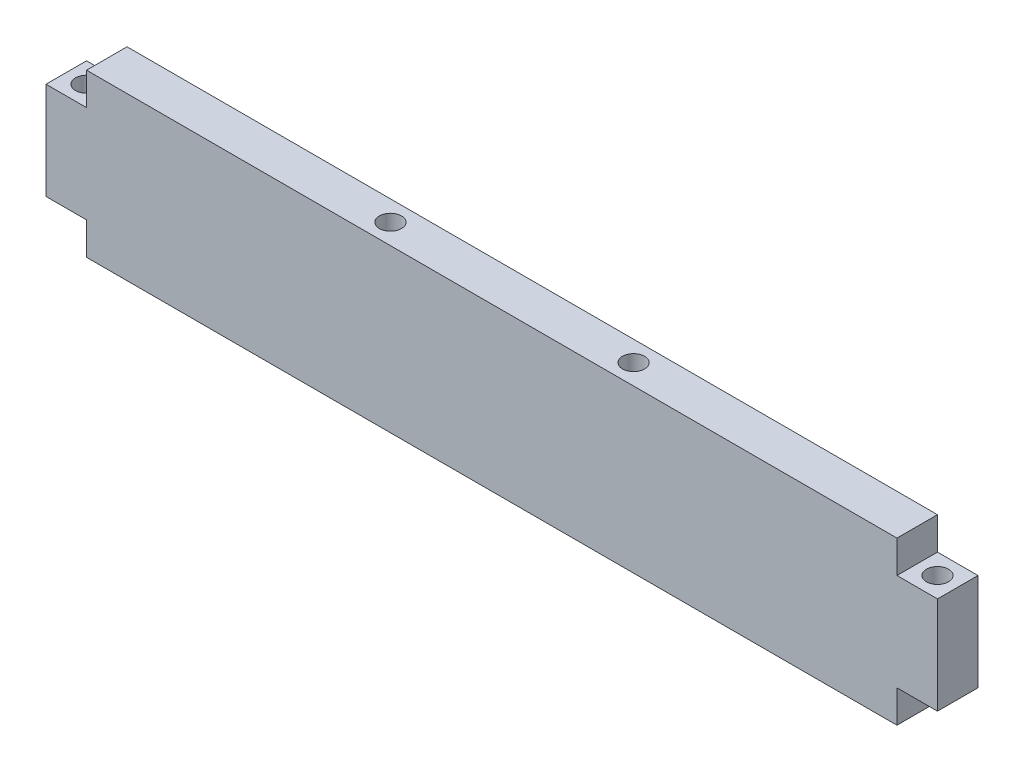
ISO-10303-21;
HEADER;
FILE_DESCRIPTION(('STEP AP214'),'2;1');
FILE_NAME('part.step','',(''),(''),'','','');
FILE_SCHEMA(('AUTOMOTIVE_DESIGN { 1 0 10303 214 1 1 1 1 }'));
ENDSEC;
DATA;
#1=APPLICATION_CONTEXT('core data for automotive mechanical design processes');
#2=APPLICATION_PROTOCOL_DEFINITION('international standard','automotive_design',2000,#1);
#3=PRODUCT_CONTEXT('',#1,'mechanical');
#4=PRODUCT('Part','Part','',(#3));
#5=PRODUCT_RELATED_PRODUCT_CATEGORY('part','',(#4));
#6=PRODUCT_DEFINITION_FORMATION('','',#4);
#7=PRODUCT_DEFINITION_CONTEXT('part definition',#1,'design');
#8=PRODUCT_DEFINITION('design','',#6,#7);
#9=PRODUCT_DEFINITION_SHAPE('','',#8);
#10=(LENGTH_UNIT() NAMED_UNIT(*) SI_UNIT(.MILLI.,.METRE.));
#11=(NAMED_UNIT(*) PLANE_ANGLE_UNIT() SI_UNIT($,.RADIAN.));
#12=(NAMED_UNIT(*) SI_UNIT($,.STERADIAN.) SOLID_ANGLE_UNIT());
#13=UNCERTAINTY_MEASURE_WITH_UNIT(LENGTH_MEASURE(1.E-05),#10,'distance_accuracy_value','');
#14=(GEOMETRIC_REPRESENTATION_CONTEXT(3) GLOBAL_UNCERTAINTY_ASSIGNED_CONTEXT((#13)) GLOBAL_UNIT_ASSIGNED_CONTEXT((#10,
#11,#12)) REPRESENTATION_CONTEXT('',''));
#15=CARTESIAN_POINT('',(0.,0.,0.));
#16=DIRECTION('',(0.,0.,1.));
#17=DIRECTION('',(1.,0.,0.));
#18=AXIS2_PLACEMENT_3D('',#15,#16,#17);
#19=CARTESIAN_POINT('',(-69.85,-12.7,3.175));
#20=DIRECTION('',(0.,1.,0.));
#21=DIRECTION('',(0.,0.,1.));
#22=AXIS2_PLACEMENT_3D('',#19,#20,#21);
#23=PLANE('',#22);
#24=DIRECTION('',(1.,0.,0.));
#25=VECTOR('',#24,1.);
#26=CARTESIAN_POINT('',(-69.85,-12.7,3.175));
#27=LINE('',#26,#25);
#28=CARTESIAN_POINT('',(-63.5,-12.7,3.175));
#29=VERTEX_POINT('',#28);
#30=CARTESIAN_POINT('',(63.5,-12.7,3.175));
#31=VERTEX_POINT('',#30);
#32=EDGE_CURVE('E11',#29,#31,#27,.T.);
#33=ORIENTED_EDGE('',*,*,#32,.F.);
#34=DIRECTION('',(0.,0.,1.));
#35=VECTOR('',#34,1.);
#36=CARTESIAN_POINT('',(-63.5,-12.7,-3.176));
#37=LINE('',#36,#35);
#38=CARTESIAN_POINT('',(-63.5,-12.7,-3.175));
#39=VERTEX_POINT('',#38);
#40=EDGE_CURVE('E146',#39,#29,#37,.T.);
#41=ORIENTED_EDGE('',*,*,#40,.F.);
#42=DIRECTION('',(1.,0.,0.));
#43=VECTOR('',#42,1.);
#44=CARTESIAN_POINT('',(-69.85,-12.7,-3.175));
#45=LINE('',#44,#43);
#46=CARTESIAN_POINT('',(63.5,-12.7,-3.175));
#47=VERTEX_POINT('',#46);
#48=EDGE_CURVE('E140',#39,#47,#45,.T.);
#49=ORIENTED_EDGE('',*,*,#48,.T.);
#50=DIRECTION('',(0.,0.,1.));
#51=VECTOR('',#50,1.);
#52=CARTESIAN_POINT('',(63.5,-12.7,-3.176));
#53=LINE('',#52,#51);
#54=EDGE_CURVE('E123',#47,#31,#53,.T.);
#55=ORIENTED_EDGE('',*,*,#54,.T.);
#56=EDGE_LOOP('',(#33,#41,#49,#55));
#57=FACE_BOUND('',#56,.T.);
#58=CARTESIAN_POINT('',(19.05,-12.7,0.));
#59=DIRECTION('',(0.,-1.,0.));
#60=DIRECTION('',(0.,0.,-1.));
#61=AXIS2_PLACEMENT_3D('',#58,#59,#60);
#62=CIRCLE('',#61,1.72719999999999);
#63=CARTESIAN_POINT('',(19.05,-12.7,-1.72719999999999));
#64=VERTEX_POINT('',#63);
#65=EDGE_CURVE('E169',#64,#64,#62,.T.);
#66=ORIENTED_EDGE('',*,*,#65,.F.);
#67=EDGE_LOOP('',(#66));
#68=FACE_BOUND('',#67,.T.);
#69=CARTESIAN_POINT('',(-19.05,-12.7,0.));
#70=DIRECTION('',(0.,-1.,0.));
#71=DIRECTION('',(0.,0.,-1.));
#72=AXIS2_PLACEMENT_3D('',#69,#70,#71);
#73=CIRCLE('',#72,1.72719999999999);
#74=CARTESIAN_POINT('',(-19.05,-12.7,-1.72719999999999));
#75=VERTEX_POINT('',#74);
#76=EDGE_CURVE('E173',#75,#75,#73,.T.);
#77=ORIENTED_EDGE('',*,*,#76,.F.);
#78=EDGE_LOOP('',(#77));
#79=FACE_BOUND('',#78,.T.);
#80=ADVANCED_FACE('F33',(#57,#68,#79),#23,.F.);
#81=CARTESIAN_POINT('',(69.85,-12.7,3.175));
#82=DIRECTION('',(-1.,0.,0.));
#83=DIRECTION('',(0.,0.,1.));
#84=AXIS2_PLACEMENT_3D('',#81,#82,#83);
#85=PLANE('',#84);
#86=DIRECTION('',(0.,1.,0.));
#87=VECTOR('',#86,1.);
#88=CARTESIAN_POINT('',(69.85,-12.7,-3.175));
#89=LINE('',#88,#87);
#90=CARTESIAN_POINT('',(69.85,-7.62,-3.175));
#91=VERTEX_POINT('',#90);
#92=CARTESIAN_POINT('',(69.85,7.62,-3.175));
#93=VERTEX_POINT('',#92);
#94=EDGE_CURVE('E238',#91,#93,#89,.T.);
#95=ORIENTED_EDGE('',*,*,#94,.T.);
#96=DIRECTION('',(0.,0.,1.));
#97=VECTOR('',#96,1.);
#98=CARTESIAN_POINT('',(69.85,7.62,-3.176));
#99=LINE('',#98,#97);
#100=CARTESIAN_POINT('',(69.85,7.62,3.175));
#101=VERTEX_POINT('',#100);
#102=EDGE_CURVE('E193',#93,#101,#99,.T.);
#103=ORIENTED_EDGE('',*,*,#102,.T.);
#104=DIRECTION('',(0.,1.,0.));
#105=VECTOR('',#104,1.);
#106=CARTESIAN_POINT('',(69.85,-12.7,3.175));
#107=LINE('',#106,#105);
#108=CARTESIAN_POINT('',(69.85,-7.62,3.175));
#109=VERTEX_POINT('',#108);
#110=EDGE_CURVE('E147',#109,#101,#107,.T.);
#111=ORIENTED_EDGE('',*,*,#110,.F.);
#112=DIRECTION('',(0.,0.,1.));
#113=VECTOR('',#112,1.);
#114=CARTESIAN_POINT('',(69.85,-7.62,-3.176));
#115=LINE('',#114,#113);
#116=EDGE_CURVE('E133',#91,#109,#115,.T.);
#117=ORIENTED_EDGE('',*,*,#116,.F.);
#118=EDGE_LOOP('',(#95,#103,#111,#117));
#119=FACE_BOUND('',#118,.T.);
#120=ADVANCED_FACE('F35',(#119),#85,.F.);
#121=CARTESIAN_POINT('',(-69.85,12.7,3.175));
#122=DIRECTION('',(0.,-1.,0.));
#123=DIRECTION('',(0.,0.,-1.));
#124=AXIS2_PLACEMENT_3D('',#121,#122,#123);
#125=PLANE('',#124);
#126=CARTESIAN_POINT('',(-19.05,12.7,0.));
#127=DIRECTION('',(0.,1.,0.));
#128=DIRECTION('',(0.,0.,1.));
#129=AXIS2_PLACEMENT_3D('',#126,#127,#128);
#130=CIRCLE('',#129,1.72719999999999);
#131=CARTESIAN_POINT('',(-19.05,12.7,1.72719999999999));
#132=VERTEX_POINT('',#131);
#133=EDGE_CURVE('E163',#132,#132,#130,.T.);
#134=ORIENTED_EDGE('',*,*,#133,.F.);
#135=EDGE_LOOP('',(#134));
#136=FACE_BOUND('',#135,.T.);
#137=CARTESIAN_POINT('',(19.05,12.7,0.));
#138=DIRECTION('',(0.,1.,0.));
#139=DIRECTION('',(0.,0.,1.));
#140=AXIS2_PLACEMENT_3D('',#137,#138,#139);
#141=CIRCLE('',#140,1.72719999999999);
#142=CARTESIAN_POINT('',(19.05,12.7,1.72719999999999));
#143=VERTEX_POINT('',#142);
#144=EDGE_CURVE('E160',#143,#143,#141,.T.);
#145=ORIENTED_EDGE('',*,*,#144,.F.);
#146=EDGE_LOOP('',(#145));
#147=FACE_BOUND('',#146,.T.);
#148=DIRECTION('',(-1.,0.,0.));
#149=VECTOR('',#148,1.);
#150=CARTESIAN_POINT('',(-69.85,12.7,3.175));
#151=LINE('',#150,#149);
#152=CARTESIAN_POINT('',(63.5,12.7,3.175));
#153=VERTEX_POINT('',#152);
#154=CARTESIAN_POINT('',(-63.5,12.7,3.175));
#155=VERTEX_POINT('',#154);
#156=EDGE_CURVE('E151',#153,#155,#151,.T.);
#157=ORIENTED_EDGE('',*,*,#156,.F.);
#158=DIRECTION('',(0.,0.,1.));
#159=VECTOR('',#158,1.);
#160=CARTESIAN_POINT('',(63.5,12.7,-3.176));
#161=LINE('',#160,#159);
#162=CARTESIAN_POINT('',(63.5,12.7,-3.175));
#163=VERTEX_POINT('',#162);
#164=EDGE_CURVE('E217',#163,#153,#161,.T.);
#165=ORIENTED_EDGE('',*,*,#164,.F.);
#166=DIRECTION('',(-1.,0.,0.));
#167=VECTOR('',#166,1.);
#168=CARTESIAN_POINT('',(-69.85,12.7,-3.175));
#169=LINE('',#168,#167);
#170=CARTESIAN_POINT('',(-63.5,12.7,-3.175));
#171=VERTEX_POINT('',#170);
#172=EDGE_CURVE('E154',#163,#171,#169,.T.);
#173=ORIENTED_EDGE('',*,*,#172,.T.);
#174=DIRECTION('',(0.,0.,1.));
#175=VECTOR('',#174,1.);
#176=CARTESIAN_POINT('',(-63.5,12.7,-3.176));
#177=LINE('',#176,#175);
#178=EDGE_CURVE('E230',#171,#155,#177,.T.);
#179=ORIENTED_EDGE('',*,*,#178,.T.);
#180=EDGE_LOOP('',(#157,#165,#173,#179));
#181=FACE_BOUND('',#180,.T.);
#182=ADVANCED_FACE('F250',(#136,#147,#181),#125,.F.);
#183=CARTESIAN_POINT('',(-69.85,-12.7,3.175));
#184=DIRECTION('',(1.,0.,0.));
#185=DIRECTION('',(0.,0.,-1.));
#186=AXIS2_PLACEMENT_3D('',#183,#184,#185);
#187=PLANE('',#186);
#188=DIRECTION('',(0.,-1.,0.));
#189=VECTOR('',#188,1.);
#190=CARTESIAN_POINT('',(-69.85,-12.7,-3.175));
#191=LINE('',#190,#189);
#192=CARTESIAN_POINT('',(-69.85,7.62,-3.175));
#193=VERTEX_POINT('',#192);
#194=CARTESIAN_POINT('',(-69.85,-7.62,-3.175));
#195=VERTEX_POINT('',#194);
#196=EDGE_CURVE('E148',#193,#195,#191,.T.);
#197=ORIENTED_EDGE('',*,*,#196,.T.);
#198=DIRECTION('',(0.,0.,1.));
#199=VECTOR('',#198,1.);
#200=CARTESIAN_POINT('',(-69.85,-7.62,-3.176));
#201=LINE('',#200,#199);
#202=CARTESIAN_POINT('',(-69.85,-7.62,3.175));
#203=VERTEX_POINT('',#202);
#204=EDGE_CURVE('E201',#195,#203,#201,.T.);
#205=ORIENTED_EDGE('',*,*,#204,.T.);
#206=DIRECTION('',(0.,-1.,0.));
#207=VECTOR('',#206,1.);
#208=CARTESIAN_POINT('',(-69.85,-12.7,3.175));
#209=LINE('',#208,#207);
#210=CARTESIAN_POINT('',(-69.85,7.62,3.175));
#211=VERTEX_POINT('',#210);
#212=EDGE_CURVE('E42',#211,#203,#209,.T.);
#213=ORIENTED_EDGE('',*,*,#212,.F.);
#214=DIRECTION('',(0.,0.,1.));
#215=VECTOR('',#214,1.);
#216=CARTESIAN_POINT('',(-69.85,7.62,-3.176));
#217=LINE('',#216,#215);
#218=EDGE_CURVE('E229',#193,#211,#217,.T.);
#219=ORIENTED_EDGE('',*,*,#218,.F.);
#220=EDGE_LOOP('',(#197,#205,#213,#219));
#221=FACE_BOUND('',#220,.T.);
#222=ADVANCED_FACE('F290',(#221),#187,.F.);
#223=CARTESIAN_POINT('',(0.,0.,3.175));
#224=DIRECTION('',(0.,0.,-1.));
#225=DIRECTION('',(-1.,0.,0.));
#226=AXIS2_PLACEMENT_3D('',#223,#224,#225);
#227=PLANE('',#226);
#228=DIRECTION('',(-1.,0.,0.));
#229=VECTOR('',#228,1.);
#230=CARTESIAN_POINT('',(-69.85,-7.62,3.175));
#231=LINE('',#230,#229);
#232=CARTESIAN_POINT('',(-63.5,-7.62,3.175));
#233=VERTEX_POINT('',#232);
#234=EDGE_CURVE('E196',#233,#203,#231,.T.);
#235=ORIENTED_EDGE('',*,*,#234,.F.);
#236=DIRECTION('',(0.,1.,0.));
#237=VECTOR('',#236,1.);
#238=CARTESIAN_POINT('',(-63.5,-7.62,3.175));
#239=LINE('',#238,#237);
#240=EDGE_CURVE('E192',#29,#233,#239,.T.);
#241=ORIENTED_EDGE('',*,*,#240,.F.);
#242=ORIENTED_EDGE('',*,*,#32,.T.);
#243=DIRECTION('',(0.,-1.,0.));
#244=VECTOR('',#243,1.);
#245=CARTESIAN_POINT('',(63.5,-12.7,3.175));
#246=LINE('',#245,#244);
#247=CARTESIAN_POINT('',(63.5,-7.62,3.175));
#248=VERTEX_POINT('',#247);
#249=EDGE_CURVE('E129',#248,#31,#246,.T.);
#250=ORIENTED_EDGE('',*,*,#249,.F.);
#251=DIRECTION('',(-1.,0.,0.));
#252=VECTOR('',#251,1.);
#253=CARTESIAN_POINT('',(69.85,-7.62,3.175));
#254=LINE('',#253,#252);
#255=EDGE_CURVE('E134',#109,#248,#254,.T.);
#256=ORIENTED_EDGE('',*,*,#255,.F.);
#257=ORIENTED_EDGE('',*,*,#110,.T.);
#258=DIRECTION('',(1.,0.,0.));
#259=VECTOR('',#258,1.);
#260=CARTESIAN_POINT('',(69.85,7.62,3.175));
#261=LINE('',#260,#259);
#262=CARTESIAN_POINT('',(63.5,7.62,3.175));
#263=VERTEX_POINT('',#262);
#264=EDGE_CURVE('E215',#263,#101,#261,.T.);
#265=ORIENTED_EDGE('',*,*,#264,.F.);
#266=DIRECTION('',(0.,-1.,0.));
#267=VECTOR('',#266,1.);
#268=CARTESIAN_POINT('',(63.5,7.62,3.175));
#269=LINE('',#268,#267);
#270=EDGE_CURVE('E213',#153,#263,#269,.T.);
#271=ORIENTED_EDGE('',*,*,#270,.F.);
#272=ORIENTED_EDGE('',*,*,#156,.T.);
#273=DIRECTION('',(0.,1.,0.));
#274=VECTOR('',#273,1.);
#275=CARTESIAN_POINT('',(-63.5,12.7,3.175));
#276=LINE('',#275,#274);
#277=CARTESIAN_POINT('',(-63.5,7.62,3.175));
#278=VERTEX_POINT('',#277);
#279=EDGE_CURVE('E227',#278,#155,#276,.T.);
#280=ORIENTED_EDGE('',*,*,#279,.F.);
#281=DIRECTION('',(1.,0.,0.));
#282=VECTOR('',#281,1.);
#283=CARTESIAN_POINT('',(-69.85,7.62,3.175));
#284=LINE('',#283,#282);
#285=EDGE_CURVE('E224',#211,#278,#284,.T.);
#286=ORIENTED_EDGE('',*,*,#285,.F.);
#287=ORIENTED_EDGE('',*,*,#212,.T.);
#288=EDGE_LOOP('',(#235,#241,#242,#250,#256,#257,#265,#271,#272,#280,#286,#287));
#289=FACE_BOUND('',#288,.T.);
#290=ADVANCED_FACE('F259',(#289),#227,.F.);
#291=CARTESIAN_POINT('',(0.,0.,-3.175));
#292=DIRECTION('',(0.,0.,-1.));
#293=DIRECTION('',(-1.,0.,0.));
#294=AXIS2_PLACEMENT_3D('',#291,#292,#293);
#295=PLANE('',#294);
#296=DIRECTION('',(0.,1.,0.));
#297=VECTOR('',#296,1.);
#298=CARTESIAN_POINT('',(-63.5,-7.62,-3.175));
#299=LINE('',#298,#297);
#300=CARTESIAN_POINT('',(-63.5,-7.62,-3.175));
#301=VERTEX_POINT('',#300);
#302=EDGE_CURVE('E190',#39,#301,#299,.T.);
#303=ORIENTED_EDGE('',*,*,#302,.T.);
#304=DIRECTION('',(-1.,0.,0.));
#305=VECTOR('',#304,1.);
#306=CARTESIAN_POINT('',(-69.85,-7.62,-3.175));
#307=LINE('',#306,#305);
#308=EDGE_CURVE('E200',#301,#195,#307,.T.);
#309=ORIENTED_EDGE('',*,*,#308,.T.);
#310=ORIENTED_EDGE('',*,*,#196,.F.);
#311=DIRECTION('',(1.,0.,0.));
#312=VECTOR('',#311,1.);
#313=CARTESIAN_POINT('',(-69.85,7.62,-3.175));
#314=LINE('',#313,#312);
#315=CARTESIAN_POINT('',(-63.5,7.62,-3.175));
#316=VERTEX_POINT('',#315);
#317=EDGE_CURVE('E233',#193,#316,#314,.T.);
#318=ORIENTED_EDGE('',*,*,#317,.T.);
#319=DIRECTION('',(0.,1.,0.));
#320=VECTOR('',#319,1.);
#321=CARTESIAN_POINT('',(-63.5,12.7,-3.175));
#322=LINE('',#321,#320);
#323=EDGE_CURVE('E207',#316,#171,#322,.T.);
#324=ORIENTED_EDGE('',*,*,#323,.T.);
#325=ORIENTED_EDGE('',*,*,#172,.F.);
#326=DIRECTION('',(0.,-1.,0.));
#327=VECTOR('',#326,1.);
#328=CARTESIAN_POINT('',(63.5,7.62,-3.175));
#329=LINE('',#328,#327);
#330=CARTESIAN_POINT('',(63.5,7.62,-3.175));
#331=VERTEX_POINT('',#330);
#332=EDGE_CURVE('E188',#163,#331,#329,.T.);
#333=ORIENTED_EDGE('',*,*,#332,.T.);
#334=DIRECTION('',(1.,0.,0.));
#335=VECTOR('',#334,1.);
#336=CARTESIAN_POINT('',(69.85,7.62,-3.175));
#337=LINE('',#336,#335);
#338=EDGE_CURVE('E210',#331,#93,#337,.T.);
#339=ORIENTED_EDGE('',*,*,#338,.T.);
#340=ORIENTED_EDGE('',*,*,#94,.F.);
#341=DIRECTION('',(-1.,0.,0.));
#342=VECTOR('',#341,1.);
#343=CARTESIAN_POINT('',(69.85,-7.62,-3.175));
#344=LINE('',#343,#342);
#345=CARTESIAN_POINT('',(63.5,-7.62,-3.175));
#346=VERTEX_POINT('',#345);
#347=EDGE_CURVE('E142',#91,#346,#344,.T.);
#348=ORIENTED_EDGE('',*,*,#347,.T.);
#349=DIRECTION('',(0.,-1.,0.));
#350=VECTOR('',#349,1.);
#351=CARTESIAN_POINT('',(63.5,-12.7,-3.175));
#352=LINE('',#351,#350);
#353=EDGE_CURVE('E126',#346,#47,#352,.T.);
#354=ORIENTED_EDGE('',*,*,#353,.T.);
#355=ORIENTED_EDGE('',*,*,#48,.F.);
#356=EDGE_LOOP('',(#303,#309,#310,#318,#324,#325,#333,#339,#340,#348,#354,#355));
#357=FACE_BOUND('',#356,.T.);
#358=ADVANCED_FACE('F139',(#357),#295,.T.);
#359=CARTESIAN_POINT('',(-63.5,12.7,-3.176));
#360=DIRECTION('',(1.,0.,0.));
#361=DIRECTION('',(0.,0.,-1.));
#362=AXIS2_PLACEMENT_3D('',#359,#360,#361);
#363=PLANE('',#362);
#364=DIRECTION('',(0.,0.,1.));
#365=VECTOR('',#364,1.);
#366=CARTESIAN_POINT('',(-63.5,7.62,-3.176));
#367=LINE('',#366,#365);
#368=EDGE_CURVE('E234',#316,#278,#367,.T.);
#369=ORIENTED_EDGE('',*,*,#368,.T.);
#370=ORIENTED_EDGE('',*,*,#279,.T.);
#371=ORIENTED_EDGE('',*,*,#178,.F.);
#372=ORIENTED_EDGE('',*,*,#323,.F.);
#373=EDGE_LOOP('',(#369,#370,#371,#372));
#374=FACE_BOUND('',#373,.T.);
#375=ADVANCED_FACE('F254',(#374),#363,.F.);
#376=CARTESIAN_POINT('',(-69.85,7.62,-3.176));
#377=DIRECTION('',(0.,-1.,0.));
#378=DIRECTION('',(0.,0.,-1.));
#379=AXIS2_PLACEMENT_3D('',#376,#377,#378);
#380=PLANE('',#379);
#381=CARTESIAN_POINT('',(-66.675,7.62,0.));
#382=DIRECTION('',(0.,-1.,0.));
#383=DIRECTION('',(0.,0.,-1.));
#384=AXIS2_PLACEMENT_3D('',#381,#382,#383);
#385=CIRCLE('',#384,1.72719999999998);
#386=CARTESIAN_POINT('',(-66.675,7.62,-1.72719999999998));
#387=VERTEX_POINT('',#386);
#388=EDGE_CURVE('E161',#387,#387,#385,.T.);
#389=ORIENTED_EDGE('',*,*,#388,.T.);
#390=EDGE_LOOP('',(#389));
#391=FACE_BOUND('',#390,.T.);
#392=ORIENTED_EDGE('',*,*,#218,.T.);
#393=ORIENTED_EDGE('',*,*,#285,.T.);
#394=ORIENTED_EDGE('',*,*,#368,.F.);
#395=ORIENTED_EDGE('',*,*,#317,.F.);
#396=EDGE_LOOP('',(#392,#393,#394,#395));
#397=FACE_BOUND('',#396,.T.);
#398=ADVANCED_FACE('F322',(#391,#397),#380,.F.);
#399=CARTESIAN_POINT('',(63.5,-12.7,-3.176));
#400=DIRECTION('',(-1.,0.,0.));
#401=DIRECTION('',(0.,0.,1.));
#402=AXIS2_PLACEMENT_3D('',#399,#400,#401);
#403=PLANE('',#402);
#404=DIRECTION('',(0.,0.,1.));
#405=VECTOR('',#404,1.);
#406=CARTESIAN_POINT('',(63.5,-7.62,-3.176));
#407=LINE('',#406,#405);
#408=EDGE_CURVE('E58',#346,#248,#407,.T.);
#409=ORIENTED_EDGE('',*,*,#408,.T.);
#410=ORIENTED_EDGE('',*,*,#249,.T.);
#411=ORIENTED_EDGE('',*,*,#54,.F.);
#412=ORIENTED_EDGE('',*,*,#353,.F.);
#413=EDGE_LOOP('',(#409,#410,#411,#412));
#414=FACE_BOUND('',#413,.T.);
#415=ADVANCED_FACE('F125',(#414),#403,.F.);
#416=CARTESIAN_POINT('',(69.85,-7.62,-3.176));
#417=DIRECTION('',(0.,1.,0.));
#418=DIRECTION('',(-1.,0.,0.));
#419=AXIS2_PLACEMENT_3D('',#416,#417,#418);
#420=PLANE('',#419);
#421=CARTESIAN_POINT('',(66.675,-7.62,0.));
#422=DIRECTION('',(0.,1.,0.));
#423=DIRECTION('',(-1.,0.,0.));
#424=AXIS2_PLACEMENT_3D('',#421,#422,#423);
#425=CIRCLE('',#424,1.72719999999998);
#426=CARTESIAN_POINT('',(64.9478,-7.62,0.));
#427=VERTEX_POINT('',#426);
#428=EDGE_CURVE('E37',#427,#427,#425,.T.);
#429=ORIENTED_EDGE('',*,*,#428,.T.);
#430=EDGE_LOOP('',(#429));
#431=FACE_BOUND('',#430,.T.);
#432=ORIENTED_EDGE('',*,*,#116,.T.);
#433=ORIENTED_EDGE('',*,*,#255,.T.);
#434=ORIENTED_EDGE('',*,*,#408,.F.);
#435=ORIENTED_EDGE('',*,*,#347,.F.);
#436=EDGE_LOOP('',(#432,#433,#434,#435));
#437=FACE_BOUND('',#436,.T.);
#438=ADVANCED_FACE('F276',(#431,#437),#420,.F.);
#439=CARTESIAN_POINT('',(69.85,7.62,-3.176));
#440=DIRECTION('',(0.,-1.,0.));
#441=DIRECTION('',(1.,0.,0.));
#442=AXIS2_PLACEMENT_3D('',#439,#440,#441);
#443=PLANE('',#442);
#444=CARTESIAN_POINT('',(66.675,7.62,0.));
#445=DIRECTION('',(0.,-1.,0.));
#446=DIRECTION('',(1.,0.,0.));
#447=AXIS2_PLACEMENT_3D('',#444,#445,#446);
#448=CIRCLE('',#447,1.72719999999998);
#449=CARTESIAN_POINT('',(68.4022,7.62,0.));
#450=VERTEX_POINT('',#449);
#451=EDGE_CURVE('E158',#450,#450,#448,.T.);
#452=ORIENTED_EDGE('',*,*,#451,.T.);
#453=EDGE_LOOP('',(#452));
#454=FACE_BOUND('',#453,.T.);
#455=DIRECTION('',(0.,0.,1.));
#456=VECTOR('',#455,1.);
#457=CARTESIAN_POINT('',(63.5,7.62,-3.176));
#458=LINE('',#457,#456);
#459=EDGE_CURVE('E50',#331,#263,#458,.T.);
#460=ORIENTED_EDGE('',*,*,#459,.T.);
#461=ORIENTED_EDGE('',*,*,#264,.T.);
#462=ORIENTED_EDGE('',*,*,#102,.F.);
#463=ORIENTED_EDGE('',*,*,#338,.F.);
#464=EDGE_LOOP('',(#460,#461,#462,#463));
#465=FACE_BOUND('',#464,.T.);
#466=ADVANCED_FACE('F266',(#454,#465),#443,.F.);
#467=CARTESIAN_POINT('',(63.5,7.62,-3.176));
#468=DIRECTION('',(-1.,0.,0.));
#469=DIRECTION('',(0.,0.,1.));
#470=AXIS2_PLACEMENT_3D('',#467,#468,#469);
#471=PLANE('',#470);
#472=ORIENTED_EDGE('',*,*,#164,.T.);
#473=ORIENTED_EDGE('',*,*,#270,.T.);
#474=ORIENTED_EDGE('',*,*,#459,.F.);
#475=ORIENTED_EDGE('',*,*,#332,.F.);
#476=EDGE_LOOP('',(#472,#473,#474,#475));
#477=FACE_BOUND('',#476,.T.);
#478=ADVANCED_FACE('F263',(#477),#471,.F.);
#479=CARTESIAN_POINT('',(-63.5,-7.62,-3.176));
#480=DIRECTION('',(1.,0.,0.));
#481=DIRECTION('',(0.,0.,-1.));
#482=AXIS2_PLACEMENT_3D('',#479,#480,#481);
#483=PLANE('',#482);
#484=ORIENTED_EDGE('',*,*,#40,.T.);
#485=ORIENTED_EDGE('',*,*,#240,.T.);
#486=DIRECTION('',(0.,0.,1.));
#487=VECTOR('',#486,1.);
#488=CARTESIAN_POINT('',(-63.5,-7.62,-3.176));
#489=LINE('',#488,#487);
#490=EDGE_CURVE('E198',#301,#233,#489,.T.);
#491=ORIENTED_EDGE('',*,*,#490,.F.);
#492=ORIENTED_EDGE('',*,*,#302,.F.);
#493=EDGE_LOOP('',(#484,#485,#491,#492));
#494=FACE_BOUND('',#493,.T.);
#495=ADVANCED_FACE('F265',(#494),#483,.F.);
#496=CARTESIAN_POINT('',(-69.85,-7.62,-3.176));
#497=DIRECTION('',(0.,1.,0.));
#498=DIRECTION('',(0.,0.,1.));
#499=AXIS2_PLACEMENT_3D('',#496,#497,#498);
#500=PLANE('',#499);
#501=CARTESIAN_POINT('',(-66.675,-7.62,0.));
#502=DIRECTION('',(0.,1.,0.));
#503=DIRECTION('',(0.,0.,1.));
#504=AXIS2_PLACEMENT_3D('',#501,#502,#503);
#505=CIRCLE('',#504,1.72719999999998);
#506=CARTESIAN_POINT('',(-66.675,-7.62,1.72719999999998));
#507=VERTEX_POINT('',#506);
#508=EDGE_CURVE('E178',#507,#507,#505,.T.);
#509=ORIENTED_EDGE('',*,*,#508,.T.);
#510=EDGE_LOOP('',(#509));
#511=FACE_BOUND('',#510,.T.);
#512=ORIENTED_EDGE('',*,*,#490,.T.);
#513=ORIENTED_EDGE('',*,*,#234,.T.);
#514=ORIENTED_EDGE('',*,*,#204,.F.);
#515=ORIENTED_EDGE('',*,*,#308,.F.);
#516=EDGE_LOOP('',(#512,#513,#514,#515));
#517=FACE_BOUND('',#516,.T.);
#518=ADVANCED_FACE('F272',(#511,#517),#500,.F.);
#519=CARTESIAN_POINT('',(66.675,12.7,0.));
#520=DIRECTION('',(0.,1.,0.));
#521=DIRECTION('',(0.,0.,1.));
#522=AXIS2_PLACEMENT_3D('',#519,#520,#521);
#523=CYLINDRICAL_SURFACE('',#522,1.72719999999998);
#524=ORIENTED_EDGE('',*,*,#451,.F.);
#525=EDGE_LOOP('',(#524));
#526=FACE_BOUND('',#525,.T.);
#527=ORIENTED_EDGE('',*,*,#428,.F.);
#528=EDGE_LOOP('',(#527));
#529=FACE_BOUND('',#528,.T.);
#530=ADVANCED_FACE('F306',(#526,#529),#523,.F.);
#531=CARTESIAN_POINT('',(19.05,12.7,0.));
#532=DIRECTION('',(0.,1.,0.));
#533=DIRECTION('',(0.,0.,1.));
#534=AXIS2_PLACEMENT_3D('',#531,#532,#533);
#535=CYLINDRICAL_SURFACE('',#534,1.72719999999999);
#536=ORIENTED_EDGE('',*,*,#144,.T.);
#537=EDGE_LOOP('',(#536));
#538=FACE_BOUND('',#537,.T.);
#539=ORIENTED_EDGE('',*,*,#65,.T.);
#540=EDGE_LOOP('',(#539));
#541=FACE_BOUND('',#540,.T.);
#542=ADVANCED_FACE('F303',(#538,#541),#535,.F.);
#543=CARTESIAN_POINT('',(-19.05,12.7,0.));
#544=DIRECTION('',(0.,1.,0.));
#545=DIRECTION('',(0.,0.,1.));
#546=AXIS2_PLACEMENT_3D('',#543,#544,#545);
#547=CYLINDRICAL_SURFACE('',#546,1.72719999999999);
#548=ORIENTED_EDGE('',*,*,#133,.T.);
#549=EDGE_LOOP('',(#548));
#550=FACE_BOUND('',#549,.T.);
#551=ORIENTED_EDGE('',*,*,#76,.T.);
#552=EDGE_LOOP('',(#551));
#553=FACE_BOUND('',#552,.T.);
#554=ADVANCED_FACE('F305',(#550,#553),#547,.F.);
#555=CARTESIAN_POINT('',(-66.675,12.7,0.));
#556=DIRECTION('',(0.,1.,0.));
#557=DIRECTION('',(0.,0.,1.));
#558=AXIS2_PLACEMENT_3D('',#555,#556,#557);
#559=CYLINDRICAL_SURFACE('',#558,1.72719999999998);
#560=ORIENTED_EDGE('',*,*,#388,.F.);
#561=EDGE_LOOP('',(#560));
#562=FACE_BOUND('',#561,.T.);
#563=ORIENTED_EDGE('',*,*,#508,.F.);
#564=EDGE_LOOP('',(#563));
#565=FACE_BOUND('',#564,.T.);
#566=ADVANCED_FACE('F312',(#562,#565),#559,.F.);
#567=CLOSED_SHELL('',(#80,#120,#182,#222,#290,#358,#375,#398,#415,#438,#466,#478,#495,#518,#530,
#542,#554,#566));
#568=MANIFOLD_SOLID_BREP('B2',#567);
#569=ADVANCED_BREP_SHAPE_REPRESENTATION('',(#18,#568),#14);
#570=SHAPE_DEFINITION_REPRESENTATION(#9,#569);
ENDSEC;
END-ISO-10303-21;
